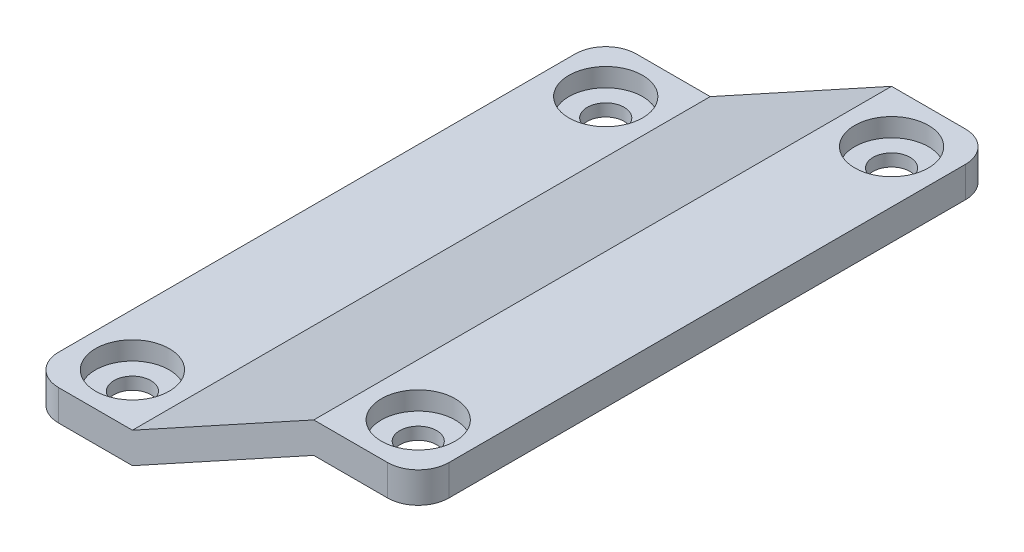
ISO-10303-21;
HEADER;
FILE_DESCRIPTION(('STEP AP214'),'2;1');
FILE_NAME('part.step','',(''),(''),'','','');
FILE_SCHEMA(('AUTOMOTIVE_DESIGN { 1 0 10303 214 1 1 1 1 }'));
ENDSEC;
DATA;
#1=APPLICATION_CONTEXT('core data for automotive mechanical design processes');
#2=APPLICATION_PROTOCOL_DEFINITION('international standard','automotive_design',2000,#1);
#3=PRODUCT_CONTEXT('',#1,'mechanical');
#4=PRODUCT('Part','Part','',(#3));
#5=PRODUCT_RELATED_PRODUCT_CATEGORY('part','',(#4));
#6=PRODUCT_DEFINITION_FORMATION('','',#4);
#7=PRODUCT_DEFINITION_CONTEXT('part definition',#1,'design');
#8=PRODUCT_DEFINITION('design','',#6,#7);
#9=PRODUCT_DEFINITION_SHAPE('','',#8);
#10=(LENGTH_UNIT() NAMED_UNIT(*) SI_UNIT(.MILLI.,.METRE.));
#11=(NAMED_UNIT(*) PLANE_ANGLE_UNIT() SI_UNIT($,.RADIAN.));
#12=(NAMED_UNIT(*) SI_UNIT($,.STERADIAN.) SOLID_ANGLE_UNIT());
#13=UNCERTAINTY_MEASURE_WITH_UNIT(LENGTH_MEASURE(1.E-05),#10,'distance_accuracy_value','');
#14=(GEOMETRIC_REPRESENTATION_CONTEXT(3) GLOBAL_UNCERTAINTY_ASSIGNED_CONTEXT((#13)) GLOBAL_UNIT_ASSIGNED_CONTEXT((#10,
#11,#12)) REPRESENTATION_CONTEXT('',''));
#15=CARTESIAN_POINT('',(0.,0.,0.));
#16=DIRECTION('',(0.,0.,1.));
#17=DIRECTION('',(1.,0.,0.));
#18=AXIS2_PLACEMENT_3D('',#15,#16,#17);
#19=CARTESIAN_POINT('',(-15.0077541769523,-9.56898329219079,-94.));
#20=DIRECTION('',(0.48134834326553,-0.876529390514391,0.));
#21=DIRECTION('',(0.876529390514391,0.48134834326553,0.));
#22=AXIS2_PLACEMENT_3D('',#19,#20,#21);
#23=PLANE('',#22);
#24=DIRECTION('',(0.876529390514391,0.48134834326553,0.));
#25=VECTOR('',#24,1.);
#26=CARTESIAN_POINT('',(-15.0077541769523,-9.56898329219079,0.));
#27=LINE('',#26,#25);
#28=CARTESIAN_POINT('',(-15.0077541769523,-9.56898329219079,0.));
#29=VERTEX_POINT('',#28);
#30=CARTESIAN_POINT('',(14.4922458230477,6.6310167078092,0.));
#31=VERTEX_POINT('',#30);
#32=EDGE_CURVE('E181',#29,#31,#27,.T.);
#33=ORIENTED_EDGE('',*,*,#32,.F.);
#34=DIRECTION('',(0.,0.,1.));
#35=VECTOR('',#34,1.);
#36=CARTESIAN_POINT('',(-15.0077541769523,-9.56898329219079,-94.));
#37=LINE('',#36,#35);
#38=CARTESIAN_POINT('',(-15.0077541769523,-9.56898329219079,-94.));
#39=VERTEX_POINT('',#38);
#40=EDGE_CURVE('E158',#39,#29,#37,.T.);
#41=ORIENTED_EDGE('',*,*,#40,.F.);
#42=DIRECTION('',(0.876529390514391,0.48134834326553,0.));
#43=VECTOR('',#42,1.);
#44=CARTESIAN_POINT('',(-15.0077541769523,-9.56898329219079,-94.));
#45=LINE('',#44,#43);
#46=CARTESIAN_POINT('',(14.4922458230477,6.6310167078092,-94.));
#47=VERTEX_POINT('',#46);
#48=EDGE_CURVE('E149',#39,#47,#45,.T.);
#49=ORIENTED_EDGE('',*,*,#48,.T.);
#50=DIRECTION('',(0.,0.,1.));
#51=VECTOR('',#50,1.);
#52=CARTESIAN_POINT('',(14.4922458230477,6.6310167078092,-94.));
#53=LINE('',#52,#51);
#54=EDGE_CURVE('E131',#47,#31,#53,.T.);
#55=ORIENTED_EDGE('',*,*,#54,.T.);
#56=EDGE_LOOP('',(#33,#41,#49,#55));
#57=FACE_BOUND('',#56,.T.);
#58=ADVANCED_FACE('F41',(#57),#23,.T.);
#59=CARTESIAN_POINT('',(-15.0077541769523,-9.56898329219079,-94.));
#60=DIRECTION('',(0.,-1.,0.));
#61=DIRECTION('',(1.,0.,0.));
#62=AXIS2_PLACEMENT_3D('',#59,#60,#61);
#63=PLANE('',#62);
#64=CARTESIAN_POINT('',(-23.5077541769523,-9.56898329219079,-85.5));
#65=DIRECTION('',(0.,1.,0.));
#66=DIRECTION('',(0.,0.,1.));
#67=AXIS2_PLACEMENT_3D('',#64,#65,#66);
#68=CIRCLE('',#67,3.);
#69=CARTESIAN_POINT('',(-23.5077541769523,-9.56898329219079,-82.5));
#70=VERTEX_POINT('',#69);
#71=EDGE_CURVE('E429',#70,#70,#68,.T.);
#72=ORIENTED_EDGE('',*,*,#71,.T.);
#73=EDGE_LOOP('',(#72));
#74=FACE_BOUND('',#73,.T.);
#75=CARTESIAN_POINT('',(-23.5077541769523,-9.56898329219079,-8.5));
#76=DIRECTION('',(0.,1.,0.));
#77=DIRECTION('',(0.,0.,1.));
#78=AXIS2_PLACEMENT_3D('',#75,#76,#77);
#79=CIRCLE('',#78,3.);
#80=CARTESIAN_POINT('',(-23.5077541769523,-9.56898329219079,-5.5));
#81=VERTEX_POINT('',#80);
#82=EDGE_CURVE('E166',#81,#81,#79,.T.);
#83=ORIENTED_EDGE('',*,*,#82,.T.);
#84=EDGE_LOOP('',(#83));
#85=FACE_BOUND('',#84,.T.);
#86=DIRECTION('',(0.,0.,1.));
#87=VECTOR('',#86,1.);
#88=CARTESIAN_POINT('',(-32.0077541769523,-9.5689832921908,-94.));
#89=LINE('',#88,#87);
#90=CARTESIAN_POINT('',(-32.0077541769523,-9.5689832921908,-89.));
#91=VERTEX_POINT('',#90);
#92=CARTESIAN_POINT('',(-32.0077541769523,-9.5689832921908,-5.));
#93=VERTEX_POINT('',#92);
#94=EDGE_CURVE('E199',#91,#93,#89,.T.);
#95=ORIENTED_EDGE('',*,*,#94,.F.);
#96=CARTESIAN_POINT('',(-27.0077541769523,-9.56898329219079,-89.));
#97=DIRECTION('',(0.,-1.,0.));
#98=DIRECTION('',(1.,0.,0.));
#99=AXIS2_PLACEMENT_3D('',#96,#97,#98);
#100=CIRCLE('',#99,5.);
#101=CARTESIAN_POINT('',(-27.0077541769523,-9.56898329219079,-94.));
#102=VERTEX_POINT('',#101);
#103=EDGE_CURVE('E229',#91,#102,#100,.T.);
#104=ORIENTED_EDGE('',*,*,#103,.T.);
#105=DIRECTION('',(1.,0.,0.));
#106=VECTOR('',#105,1.);
#107=CARTESIAN_POINT('',(-15.0077541769523,-9.56898329219079,-94.));
#108=LINE('',#107,#106);
#109=EDGE_CURVE('E143',#102,#39,#108,.T.);
#110=ORIENTED_EDGE('',*,*,#109,.T.);
#111=ORIENTED_EDGE('',*,*,#40,.T.);
#112=DIRECTION('',(1.,0.,0.));
#113=VECTOR('',#112,1.);
#114=CARTESIAN_POINT('',(-15.0077541769523,-9.56898329219079,0.));
#115=LINE('',#114,#113);
#116=CARTESIAN_POINT('',(-27.0077541769523,-9.56898329219079,0.));
#117=VERTEX_POINT('',#116);
#118=EDGE_CURVE('E160',#117,#29,#115,.T.);
#119=ORIENTED_EDGE('',*,*,#118,.F.);
#120=CARTESIAN_POINT('',(-27.0077541769523,-9.56898329219079,-5.));
#121=DIRECTION('',(0.,-1.,0.));
#122=DIRECTION('',(1.,0.,0.));
#123=AXIS2_PLACEMENT_3D('',#120,#121,#122);
#124=CIRCLE('',#123,5.);
#125=EDGE_CURVE('E226',#117,#93,#124,.T.);
#126=ORIENTED_EDGE('',*,*,#125,.T.);
#127=EDGE_LOOP('',(#95,#104,#110,#111,#119,#126));
#128=FACE_BOUND('',#127,.T.);
#129=ADVANCED_FACE('F270',(#74,#85,#128),#63,.T.);
#130=CARTESIAN_POINT('',(-32.0077541769523,-9.5689832921908,-94.));
#131=DIRECTION('',(-1.,0.,0.));
#132=DIRECTION('',(0.,0.,1.));
#133=AXIS2_PLACEMENT_3D('',#130,#131,#132);
#134=PLANE('',#133);
#135=DIRECTION('',(0.,0.,1.));
#136=VECTOR('',#135,1.);
#137=CARTESIAN_POINT('',(-32.0077541769523,-4.5689832921908,-94.));
#138=LINE('',#137,#136);
#139=CARTESIAN_POINT('',(-32.0077541769523,-4.5689832921908,-89.));
#140=VERTEX_POINT('',#139);
#141=CARTESIAN_POINT('',(-32.0077541769523,-4.5689832921908,-5.));
#142=VERTEX_POINT('',#141);
#143=EDGE_CURVE('E203',#140,#142,#138,.T.);
#144=ORIENTED_EDGE('',*,*,#143,.F.);
#145=DIRECTION('',(0.,-1.,0.));
#146=VECTOR('',#145,1.);
#147=CARTESIAN_POINT('',(-32.0077541769523,-9.5689832921908,-89.));
#148=LINE('',#147,#146);
#149=EDGE_CURVE('E222',#140,#91,#148,.T.);
#150=ORIENTED_EDGE('',*,*,#149,.T.);
#151=ORIENTED_EDGE('',*,*,#94,.T.);
#152=DIRECTION('',(0.,-1.,0.));
#153=VECTOR('',#152,1.);
#154=CARTESIAN_POINT('',(-32.0077541769523,-9.5689832921908,-5.));
#155=LINE('',#154,#153);
#156=EDGE_CURVE('E198',#93,#142,#155,.F.);
#157=ORIENTED_EDGE('',*,*,#156,.T.);
#158=EDGE_LOOP('',(#144,#150,#151,#157));
#159=FACE_BOUND('',#158,.T.);
#160=ADVANCED_FACE('F293',(#159),#134,.T.);
#161=CARTESIAN_POINT('',(-15.0077541769523,-4.5689832921908,-94.));
#162=DIRECTION('',(0.,1.,0.));
#163=DIRECTION('',(-1.,0.,0.));
#164=AXIS2_PLACEMENT_3D('',#161,#162,#163);
#165=PLANE('',#164);
#166=CARTESIAN_POINT('',(-23.5077541769523,-4.56898329219079,-85.5));
#167=DIRECTION('',(0.,1.,0.));
#168=DIRECTION('',(0.,0.,1.));
#169=AXIS2_PLACEMENT_3D('',#166,#167,#168);
#170=CIRCLE('',#169,6.);
#171=CARTESIAN_POINT('',(-23.5077541769523,-4.56898329219079,-79.5));
#172=VERTEX_POINT('',#171);
#173=EDGE_CURVE('E417',#172,#172,#170,.T.);
#174=ORIENTED_EDGE('',*,*,#173,.F.);
#175=EDGE_LOOP('',(#174));
#176=FACE_BOUND('',#175,.T.);
#177=CARTESIAN_POINT('',(-23.5077541769523,-4.56898329219079,-8.5));
#178=DIRECTION('',(0.,1.,0.));
#179=DIRECTION('',(0.,0.,1.));
#180=AXIS2_PLACEMENT_3D('',#177,#178,#179);
#181=CIRCLE('',#180,6.);
#182=CARTESIAN_POINT('',(-23.5077541769523,-4.56898329219079,-2.5));
#183=VERTEX_POINT('',#182);
#184=EDGE_CURVE('E433',#183,#183,#181,.T.);
#185=ORIENTED_EDGE('',*,*,#184,.F.);
#186=EDGE_LOOP('',(#185));
#187=FACE_BOUND('',#186,.T.);
#188=DIRECTION('',(-1.,0.,0.));
#189=VECTOR('',#188,1.);
#190=CARTESIAN_POINT('',(-15.0077541769523,-4.5689832921908,-94.));
#191=LINE('',#190,#189);
#192=CARTESIAN_POINT('',(-15.0077541769523,-4.5689832921908,-94.));
#193=VERTEX_POINT('',#192);
#194=CARTESIAN_POINT('',(-27.0077541769523,-4.5689832921908,-94.));
#195=VERTEX_POINT('',#194);
#196=EDGE_CURVE('E175',#193,#195,#191,.T.);
#197=ORIENTED_EDGE('',*,*,#196,.T.);
#198=CARTESIAN_POINT('',(-27.0077541769523,-4.5689832921908,-89.));
#199=DIRECTION('',(0.,1.,0.));
#200=DIRECTION('',(-1.,0.,0.));
#201=AXIS2_PLACEMENT_3D('',#198,#199,#200);
#202=CIRCLE('',#201,5.);
#203=EDGE_CURVE('E240',#195,#140,#202,.T.);
#204=ORIENTED_EDGE('',*,*,#203,.T.);
#205=ORIENTED_EDGE('',*,*,#143,.T.);
#206=CARTESIAN_POINT('',(-27.0077541769523,-4.5689832921908,-5.));
#207=DIRECTION('',(0.,1.,0.));
#208=DIRECTION('',(-1.,0.,0.));
#209=AXIS2_PLACEMENT_3D('',#206,#207,#208);
#210=CIRCLE('',#209,5.);
#211=CARTESIAN_POINT('',(-27.0077541769523,-4.5689832921908,0.));
#212=VERTEX_POINT('',#211);
#213=EDGE_CURVE('E237',#142,#212,#210,.T.);
#214=ORIENTED_EDGE('',*,*,#213,.T.);
#215=DIRECTION('',(-1.,0.,0.));
#216=VECTOR('',#215,1.);
#217=CARTESIAN_POINT('',(-15.0077541769523,-4.5689832921908,0.));
#218=LINE('',#217,#216);
#219=CARTESIAN_POINT('',(-15.0077541769523,-4.5689832921908,0.));
#220=VERTEX_POINT('',#219);
#221=EDGE_CURVE('E163',#220,#212,#218,.T.);
#222=ORIENTED_EDGE('',*,*,#221,.F.);
#223=DIRECTION('',(0.,0.,1.));
#224=VECTOR('',#223,1.);
#225=CARTESIAN_POINT('',(-15.0077541769523,-4.5689832921908,-94.));
#226=LINE('',#225,#224);
#227=EDGE_CURVE('E207',#193,#220,#226,.T.);
#228=ORIENTED_EDGE('',*,*,#227,.F.);
#229=EDGE_LOOP('',(#197,#204,#205,#214,#222,#228));
#230=FACE_BOUND('',#229,.T.);
#231=ADVANCED_FACE('F289',(#176,#187,#230),#165,.T.);
#232=CARTESIAN_POINT('',(-15.0077541769523,-4.5689832921908,-94.));
#233=DIRECTION('',(-0.48134834326553,0.876529390514391,0.));
#234=DIRECTION('',(-0.876529390514391,-0.48134834326553,0.));
#235=AXIS2_PLACEMENT_3D('',#232,#233,#234);
#236=PLANE('',#235);
#237=DIRECTION('',(-0.876529390514391,-0.48134834326553,0.));
#238=VECTOR('',#237,1.);
#239=CARTESIAN_POINT('',(-15.0077541769523,-4.5689832921908,0.));
#240=LINE('',#239,#238);
#241=CARTESIAN_POINT('',(14.4922458230477,11.6310167078092,0.));
#242=VERTEX_POINT('',#241);
#243=EDGE_CURVE('E189',#242,#220,#240,.T.);
#244=ORIENTED_EDGE('',*,*,#243,.F.);
#245=DIRECTION('',(0.,0.,1.));
#246=VECTOR('',#245,1.);
#247=CARTESIAN_POINT('',(14.4922458230477,11.6310167078092,-94.));
#248=LINE('',#247,#246);
#249=CARTESIAN_POINT('',(14.4922458230477,11.6310167078092,-94.));
#250=VERTEX_POINT('',#249);
#251=EDGE_CURVE('E210',#250,#242,#248,.T.);
#252=ORIENTED_EDGE('',*,*,#251,.F.);
#253=DIRECTION('',(-0.876529390514391,-0.48134834326553,0.));
#254=VECTOR('',#253,1.);
#255=CARTESIAN_POINT('',(-15.0077541769523,-4.5689832921908,-94.));
#256=LINE('',#255,#254);
#257=EDGE_CURVE('E171',#250,#193,#256,.T.);
#258=ORIENTED_EDGE('',*,*,#257,.T.);
#259=ORIENTED_EDGE('',*,*,#227,.T.);
#260=EDGE_LOOP('',(#244,#252,#258,#259));
#261=FACE_BOUND('',#260,.T.);
#262=ADVANCED_FACE('F285',(#261),#236,.T.);
#263=CARTESIAN_POINT('',(14.4922458230477,11.6310167078092,-94.));
#264=DIRECTION('',(0.,1.,0.));
#265=DIRECTION('',(0.,0.,1.));
#266=AXIS2_PLACEMENT_3D('',#263,#264,#265);
#267=PLANE('',#266);
#268=CARTESIAN_POINT('',(22.9922458230477,11.6310167078092,-8.49999999999999));
#269=DIRECTION('',(0.,1.,0.));
#270=DIRECTION('',(0.,0.,1.));
#271=AXIS2_PLACEMENT_3D('',#268,#269,#270);
#272=CIRCLE('',#271,6.);
#273=CARTESIAN_POINT('',(22.9922458230477,11.6310167078092,-2.5));
#274=VERTEX_POINT('',#273);
#275=EDGE_CURVE('E389',#274,#274,#272,.T.);
#276=ORIENTED_EDGE('',*,*,#275,.F.);
#277=EDGE_LOOP('',(#276));
#278=FACE_BOUND('',#277,.T.);
#279=CARTESIAN_POINT('',(22.9922458230477,11.6310167078092,-85.5));
#280=DIRECTION('',(0.,1.,0.));
#281=DIRECTION('',(0.,0.,1.));
#282=AXIS2_PLACEMENT_3D('',#279,#280,#281);
#283=CIRCLE('',#282,6.);
#284=CARTESIAN_POINT('',(22.9922458230477,11.6310167078092,-79.5));
#285=VERTEX_POINT('',#284);
#286=EDGE_CURVE('E401',#285,#285,#283,.T.);
#287=ORIENTED_EDGE('',*,*,#286,.F.);
#288=EDGE_LOOP('',(#287));
#289=FACE_BOUND('',#288,.T.);
#290=DIRECTION('',(0.,0.,1.));
#291=VECTOR('',#290,1.);
#292=CARTESIAN_POINT('',(31.4922458230477,11.6310167078092,-94.));
#293=LINE('',#292,#291);
#294=CARTESIAN_POINT('',(31.4922458230477,11.6310167078092,-89.));
#295=VERTEX_POINT('',#294);
#296=CARTESIAN_POINT('',(31.4922458230477,11.6310167078092,-5.));
#297=VERTEX_POINT('',#296);
#298=EDGE_CURVE('E214',#295,#297,#293,.T.);
#299=ORIENTED_EDGE('',*,*,#298,.F.);
#300=CARTESIAN_POINT('',(26.4922458230477,11.6310167078092,-89.));
#301=DIRECTION('',(0.,1.,0.));
#302=DIRECTION('',(0.,0.,1.));
#303=AXIS2_PLACEMENT_3D('',#300,#301,#302);
#304=CIRCLE('',#303,5.);
#305=CARTESIAN_POINT('',(26.4922458230477,11.6310167078092,-94.));
#306=VERTEX_POINT('',#305);
#307=EDGE_CURVE('E252',#295,#306,#304,.T.);
#308=ORIENTED_EDGE('',*,*,#307,.T.);
#309=DIRECTION('',(-1.,0.,0.));
#310=VECTOR('',#309,1.);
#311=CARTESIAN_POINT('',(14.4922458230477,11.6310167078092,-94.));
#312=LINE('',#311,#310);
#313=EDGE_CURVE('E154',#306,#250,#312,.T.);
#314=ORIENTED_EDGE('',*,*,#313,.T.);
#315=ORIENTED_EDGE('',*,*,#251,.T.);
#316=DIRECTION('',(-1.,0.,0.));
#317=VECTOR('',#316,1.);
#318=CARTESIAN_POINT('',(14.4922458230477,11.6310167078092,0.));
#319=LINE('',#318,#317);
#320=CARTESIAN_POINT('',(26.4922458230477,11.6310167078092,0.));
#321=VERTEX_POINT('',#320);
#322=EDGE_CURVE('E186',#321,#242,#319,.T.);
#323=ORIENTED_EDGE('',*,*,#322,.F.);
#324=CARTESIAN_POINT('',(26.4922458230477,11.6310167078092,-5.));
#325=DIRECTION('',(0.,1.,0.));
#326=DIRECTION('',(0.,0.,1.));
#327=AXIS2_PLACEMENT_3D('',#324,#325,#326);
#328=CIRCLE('',#327,5.);
#329=EDGE_CURVE('E65',#321,#297,#328,.T.);
#330=ORIENTED_EDGE('',*,*,#329,.T.);
#331=EDGE_LOOP('',(#299,#308,#314,#315,#323,#330));
#332=FACE_BOUND('',#331,.T.);
#333=ADVANCED_FACE('F281',(#278,#289,#332),#267,.T.);
#334=CARTESIAN_POINT('',(31.4922458230477,6.6310167078092,-94.));
#335=DIRECTION('',(1.,0.,0.));
#336=DIRECTION('',(0.,0.,-1.));
#337=AXIS2_PLACEMENT_3D('',#334,#335,#336);
#338=PLANE('',#337);
#339=DIRECTION('',(0.,0.,1.));
#340=VECTOR('',#339,1.);
#341=CARTESIAN_POINT('',(31.4922458230477,6.6310167078092,-94.));
#342=LINE('',#341,#340);
#343=CARTESIAN_POINT('',(31.4922458230477,6.6310167078092,-89.));
#344=VERTEX_POINT('',#343);
#345=CARTESIAN_POINT('',(31.4922458230477,6.6310167078092,-5.));
#346=VERTEX_POINT('',#345);
#347=EDGE_CURVE('E142',#344,#346,#342,.T.);
#348=ORIENTED_EDGE('',*,*,#347,.F.);
#349=DIRECTION('',(0.,1.,0.));
#350=VECTOR('',#349,1.);
#351=CARTESIAN_POINT('',(31.4922458230477,11.6310167078092,-89.));
#352=LINE('',#351,#350);
#353=EDGE_CURVE('E246',#344,#295,#352,.T.);
#354=ORIENTED_EDGE('',*,*,#353,.T.);
#355=ORIENTED_EDGE('',*,*,#298,.T.);
#356=DIRECTION('',(0.,1.,0.));
#357=VECTOR('',#356,1.);
#358=CARTESIAN_POINT('',(31.4922458230477,6.6310167078092,-5.));
#359=LINE('',#358,#357);
#360=EDGE_CURVE('E243',#297,#346,#359,.F.);
#361=ORIENTED_EDGE('',*,*,#360,.T.);
#362=EDGE_LOOP('',(#348,#354,#355,#361));
#363=FACE_BOUND('',#362,.T.);
#364=ADVANCED_FACE('F275',(#363),#338,.T.);
#365=CARTESIAN_POINT('',(14.4922458230477,6.6310167078092,-94.));
#366=DIRECTION('',(0.,-1.,0.));
#367=DIRECTION('',(0.,0.,-1.));
#368=AXIS2_PLACEMENT_3D('',#365,#366,#367);
#369=PLANE('',#368);
#370=CARTESIAN_POINT('',(22.9922458230477,6.6310167078092,-8.49999999999999));
#371=DIRECTION('',(0.,-1.,0.));
#372=DIRECTION('',(0.,0.,-1.));
#373=AXIS2_PLACEMENT_3D('',#370,#371,#372);
#374=CIRCLE('',#373,3.);
#375=CARTESIAN_POINT('',(22.9922458230477,6.6310167078092,-11.5));
#376=VERTEX_POINT('',#375);
#377=EDGE_CURVE('E393',#376,#376,#374,.T.);
#378=ORIENTED_EDGE('',*,*,#377,.F.);
#379=EDGE_LOOP('',(#378));
#380=FACE_BOUND('',#379,.T.);
#381=CARTESIAN_POINT('',(22.9922458230477,6.6310167078092,-85.5));
#382=DIRECTION('',(0.,-1.,0.));
#383=DIRECTION('',(0.,0.,-1.));
#384=AXIS2_PLACEMENT_3D('',#381,#382,#383);
#385=CIRCLE('',#384,3.);
#386=CARTESIAN_POINT('',(22.9922458230477,6.6310167078092,-88.5));
#387=VERTEX_POINT('',#386);
#388=EDGE_CURVE('E413',#387,#387,#385,.T.);
#389=ORIENTED_EDGE('',*,*,#388,.F.);
#390=EDGE_LOOP('',(#389));
#391=FACE_BOUND('',#390,.T.);
#392=DIRECTION('',(1.,0.,0.));
#393=VECTOR('',#392,1.);
#394=CARTESIAN_POINT('',(14.4922458230477,6.6310167078092,-94.));
#395=LINE('',#394,#393);
#396=CARTESIAN_POINT('',(26.4922458230477,6.6310167078092,-94.));
#397=VERTEX_POINT('',#396);
#398=EDGE_CURVE('E134',#47,#397,#395,.T.);
#399=ORIENTED_EDGE('',*,*,#398,.T.);
#400=CARTESIAN_POINT('',(26.4922458230477,6.6310167078092,-89.));
#401=DIRECTION('',(0.,-1.,0.));
#402=DIRECTION('',(0.,0.,-1.));
#403=AXIS2_PLACEMENT_3D('',#400,#401,#402);
#404=CIRCLE('',#403,5.);
#405=EDGE_CURVE('E257',#397,#344,#404,.T.);
#406=ORIENTED_EDGE('',*,*,#405,.T.);
#407=ORIENTED_EDGE('',*,*,#347,.T.);
#408=CARTESIAN_POINT('',(26.4922458230477,6.6310167078092,-5.));
#409=DIRECTION('',(0.,-1.,0.));
#410=DIRECTION('',(0.,0.,-1.));
#411=AXIS2_PLACEMENT_3D('',#408,#409,#410);
#412=CIRCLE('',#411,5.);
#413=CARTESIAN_POINT('',(26.4922458230477,6.6310167078092,0.));
#414=VERTEX_POINT('',#413);
#415=EDGE_CURVE('E57',#346,#414,#412,.T.);
#416=ORIENTED_EDGE('',*,*,#415,.T.);
#417=DIRECTION('',(1.,0.,0.));
#418=VECTOR('',#417,1.);
#419=CARTESIAN_POINT('',(14.4922458230477,6.6310167078092,0.));
#420=LINE('',#419,#418);
#421=EDGE_CURVE('E136',#31,#414,#420,.T.);
#422=ORIENTED_EDGE('',*,*,#421,.F.);
#423=ORIENTED_EDGE('',*,*,#54,.F.);
#424=EDGE_LOOP('',(#399,#406,#407,#416,#422,#423));
#425=FACE_BOUND('',#424,.T.);
#426=ADVANCED_FACE('F133',(#380,#391,#425),#369,.T.);
#427=CARTESIAN_POINT('',(0.,0.,-94.));
#428=DIRECTION('',(0.,0.,1.));
#429=DIRECTION('',(1.,0.,0.));
#430=AXIS2_PLACEMENT_3D('',#427,#428,#429);
#431=PLANE('',#430);
#432=ORIENTED_EDGE('',*,*,#109,.F.);
#433=DIRECTION('',(0.,-1.,0.));
#434=VECTOR('',#433,1.);
#435=CARTESIAN_POINT('',(-27.0077541769523,-4.5689832921908,-94.));
#436=LINE('',#435,#434);
#437=EDGE_CURVE('E234',#102,#195,#436,.F.);
#438=ORIENTED_EDGE('',*,*,#437,.T.);
#439=ORIENTED_EDGE('',*,*,#196,.F.);
#440=ORIENTED_EDGE('',*,*,#257,.F.);
#441=ORIENTED_EDGE('',*,*,#313,.F.);
#442=DIRECTION('',(0.,1.,0.));
#443=VECTOR('',#442,1.);
#444=CARTESIAN_POINT('',(26.4922458230477,6.6310167078092,-94.));
#445=LINE('',#444,#443);
#446=EDGE_CURVE('E152',#306,#397,#445,.F.);
#447=ORIENTED_EDGE('',*,*,#446,.T.);
#448=ORIENTED_EDGE('',*,*,#398,.F.);
#449=ORIENTED_EDGE('',*,*,#48,.F.);
#450=EDGE_LOOP('',(#432,#438,#439,#440,#441,#447,#448,#449));
#451=FACE_BOUND('',#450,.T.);
#452=ADVANCED_FACE('F148',(#451),#431,.F.);
#453=CARTESIAN_POINT('',(0.,0.,0.));
#454=DIRECTION('',(0.,0.,1.));
#455=DIRECTION('',(1.,0.,0.));
#456=AXIS2_PLACEMENT_3D('',#453,#454,#455);
#457=PLANE('',#456);
#458=ORIENTED_EDGE('',*,*,#421,.T.);
#459=DIRECTION('',(0.,1.,0.));
#460=VECTOR('',#459,1.);
#461=CARTESIAN_POINT('',(26.4922458230477,0.,0.));
#462=LINE('',#461,#460);
#463=EDGE_CURVE('E11',#414,#321,#462,.T.);
#464=ORIENTED_EDGE('',*,*,#463,.T.);
#465=ORIENTED_EDGE('',*,*,#322,.T.);
#466=ORIENTED_EDGE('',*,*,#243,.T.);
#467=ORIENTED_EDGE('',*,*,#221,.T.);
#468=DIRECTION('',(0.,-1.,0.));
#469=VECTOR('',#468,1.);
#470=CARTESIAN_POINT('',(-27.0077541769523,0.,0.));
#471=LINE('',#470,#469);
#472=EDGE_CURVE('E50',#212,#117,#471,.T.);
#473=ORIENTED_EDGE('',*,*,#472,.T.);
#474=ORIENTED_EDGE('',*,*,#118,.T.);
#475=ORIENTED_EDGE('',*,*,#32,.T.);
#476=EDGE_LOOP('',(#458,#464,#465,#466,#467,#473,#474,#475));
#477=FACE_BOUND('',#476,.T.);
#478=ADVANCED_FACE('F264',(#477),#457,.T.);
#479=CARTESIAN_POINT('',(-23.5077541769523,-4.56898329219079,-8.5));
#480=DIRECTION('',(0.,1.,0.));
#481=DIRECTION('',(0.,0.,1.));
#482=AXIS2_PLACEMENT_3D('',#479,#480,#481);
#483=CYLINDRICAL_SURFACE('',#482,3.);
#484=ORIENTED_EDGE('',*,*,#82,.F.);
#485=EDGE_LOOP('',(#484));
#486=FACE_BOUND('',#485,.T.);
#487=CARTESIAN_POINT('',(-23.5077541769523,-7.56898329219079,-8.5));
#488=DIRECTION('',(0.,1.,0.));
#489=DIRECTION('',(0.,0.,1.));
#490=AXIS2_PLACEMENT_3D('',#487,#488,#489);
#491=CIRCLE('',#490,3.);
#492=CARTESIAN_POINT('',(-23.5077541769523,-7.56898329219079,-5.5));
#493=VERTEX_POINT('',#492);
#494=EDGE_CURVE('E440',#493,#493,#491,.T.);
#495=ORIENTED_EDGE('',*,*,#494,.T.);
#496=EDGE_LOOP('',(#495));
#497=FACE_BOUND('',#496,.T.);
#498=ADVANCED_FACE('F335',(#486,#497),#483,.F.);
#499=CARTESIAN_POINT('',(-20.5077541769523,-7.56898329219079,-8.5));
#500=DIRECTION('',(0.,-1.,0.));
#501=DIRECTION('',(0.,0.,-1.));
#502=AXIS2_PLACEMENT_3D('',#499,#500,#501);
#503=PLANE('',#502);
#504=ORIENTED_EDGE('',*,*,#494,.F.);
#505=EDGE_LOOP('',(#504));
#506=FACE_BOUND('',#505,.T.);
#507=CARTESIAN_POINT('',(-23.5077541769523,-7.56898329219079,-8.5));
#508=DIRECTION('',(0.,1.,0.));
#509=DIRECTION('',(0.,0.,1.));
#510=AXIS2_PLACEMENT_3D('',#507,#508,#509);
#511=CIRCLE('',#510,6.);
#512=CARTESIAN_POINT('',(-23.5077541769523,-7.56898329219079,-2.5));
#513=VERTEX_POINT('',#512);
#514=EDGE_CURVE('E437',#513,#513,#511,.T.);
#515=ORIENTED_EDGE('',*,*,#514,.T.);
#516=EDGE_LOOP('',(#515));
#517=FACE_BOUND('',#516,.T.);
#518=ADVANCED_FACE('F340',(#506,#517),#503,.F.);
#519=CARTESIAN_POINT('',(-23.5077541769523,-4.56898329219079,-8.5));
#520=DIRECTION('',(0.,1.,0.));
#521=DIRECTION('',(0.,0.,1.));
#522=AXIS2_PLACEMENT_3D('',#519,#520,#521);
#523=CYLINDRICAL_SURFACE('',#522,6.);
#524=ORIENTED_EDGE('',*,*,#514,.F.);
#525=EDGE_LOOP('',(#524));
#526=FACE_BOUND('',#525,.T.);
#527=ORIENTED_EDGE('',*,*,#184,.T.);
#528=EDGE_LOOP('',(#527));
#529=FACE_BOUND('',#528,.T.);
#530=ADVANCED_FACE('F344',(#526,#529),#523,.F.);
#531=CARTESIAN_POINT('',(-23.5077541769523,-4.56898329219079,-85.5));
#532=DIRECTION('',(0.,1.,0.));
#533=DIRECTION('',(0.,0.,1.));
#534=AXIS2_PLACEMENT_3D('',#531,#532,#533);
#535=CYLINDRICAL_SURFACE('',#534,3.);
#536=ORIENTED_EDGE('',*,*,#71,.F.);
#537=EDGE_LOOP('',(#536));
#538=FACE_BOUND('',#537,.T.);
#539=CARTESIAN_POINT('',(-23.5077541769523,-7.56898329219079,-85.5));
#540=DIRECTION('',(0.,1.,0.));
#541=DIRECTION('',(0.,0.,1.));
#542=AXIS2_PLACEMENT_3D('',#539,#540,#541);
#543=CIRCLE('',#542,3.);
#544=CARTESIAN_POINT('',(-23.5077541769523,-7.56898329219079,-82.5));
#545=VERTEX_POINT('',#544);
#546=EDGE_CURVE('E425',#545,#545,#543,.T.);
#547=ORIENTED_EDGE('',*,*,#546,.T.);
#548=EDGE_LOOP('',(#547));
#549=FACE_BOUND('',#548,.T.);
#550=ADVANCED_FACE('F348',(#538,#549),#535,.F.);
#551=CARTESIAN_POINT('',(-20.5077541769523,-7.56898329219079,-85.5));
#552=DIRECTION('',(0.,-1.,0.));
#553=DIRECTION('',(0.,0.,-1.));
#554=AXIS2_PLACEMENT_3D('',#551,#552,#553);
#555=PLANE('',#554);
#556=ORIENTED_EDGE('',*,*,#546,.F.);
#557=EDGE_LOOP('',(#556));
#558=FACE_BOUND('',#557,.T.);
#559=CARTESIAN_POINT('',(-23.5077541769523,-7.56898329219079,-85.5));
#560=DIRECTION('',(0.,1.,0.));
#561=DIRECTION('',(0.,0.,1.));
#562=AXIS2_PLACEMENT_3D('',#559,#560,#561);
#563=CIRCLE('',#562,6.);
#564=CARTESIAN_POINT('',(-23.5077541769523,-7.56898329219079,-79.5));
#565=VERTEX_POINT('',#564);
#566=EDGE_CURVE('E421',#565,#565,#563,.T.);
#567=ORIENTED_EDGE('',*,*,#566,.T.);
#568=EDGE_LOOP('',(#567));
#569=FACE_BOUND('',#568,.T.);
#570=ADVANCED_FACE('F352',(#558,#569),#555,.F.);
#571=CARTESIAN_POINT('',(-23.5077541769523,-4.56898329219079,-85.5));
#572=DIRECTION('',(0.,1.,0.));
#573=DIRECTION('',(0.,0.,1.));
#574=AXIS2_PLACEMENT_3D('',#571,#572,#573);
#575=CYLINDRICAL_SURFACE('',#574,6.);
#576=ORIENTED_EDGE('',*,*,#566,.F.);
#577=EDGE_LOOP('',(#576));
#578=FACE_BOUND('',#577,.T.);
#579=ORIENTED_EDGE('',*,*,#173,.T.);
#580=EDGE_LOOP('',(#579));
#581=FACE_BOUND('',#580,.T.);
#582=ADVANCED_FACE('F356',(#578,#581),#575,.F.);
#583=CARTESIAN_POINT('',(22.9922458230477,11.6310167078092,-85.5));
#584=DIRECTION('',(0.,1.,0.));
#585=DIRECTION('',(0.,0.,1.));
#586=AXIS2_PLACEMENT_3D('',#583,#584,#585);
#587=CYLINDRICAL_SURFACE('',#586,3.);
#588=CARTESIAN_POINT('',(22.9922458230477,8.63101670780921,-85.5));
#589=DIRECTION('',(0.,1.,0.));
#590=DIRECTION('',(0.,0.,1.));
#591=AXIS2_PLACEMENT_3D('',#588,#589,#590);
#592=CIRCLE('',#591,3.);
#593=CARTESIAN_POINT('',(22.9922458230477,8.63101670780921,-82.5));
#594=VERTEX_POINT('',#593);
#595=EDGE_CURVE('E409',#594,#594,#592,.T.);
#596=ORIENTED_EDGE('',*,*,#595,.T.);
#597=EDGE_LOOP('',(#596));
#598=FACE_BOUND('',#597,.T.);
#599=ORIENTED_EDGE('',*,*,#388,.T.);
#600=EDGE_LOOP('',(#599));
#601=FACE_BOUND('',#600,.T.);
#602=ADVANCED_FACE('F360',(#598,#601),#587,.F.);
#603=CARTESIAN_POINT('',(25.9922458230477,8.63101670780921,-85.5));
#604=DIRECTION('',(0.,-1.,0.));
#605=DIRECTION('',(0.,0.,-1.));
#606=AXIS2_PLACEMENT_3D('',#603,#604,#605);
#607=PLANE('',#606);
#608=ORIENTED_EDGE('',*,*,#595,.F.);
#609=EDGE_LOOP('',(#608));
#610=FACE_BOUND('',#609,.T.);
#611=CARTESIAN_POINT('',(22.9922458230477,8.63101670780921,-85.5));
#612=DIRECTION('',(0.,1.,0.));
#613=DIRECTION('',(0.,0.,1.));
#614=AXIS2_PLACEMENT_3D('',#611,#612,#613);
#615=CIRCLE('',#614,6.);
#616=CARTESIAN_POINT('',(22.9922458230477,8.63101670780921,-79.5));
#617=VERTEX_POINT('',#616);
#618=EDGE_CURVE('E405',#617,#617,#615,.T.);
#619=ORIENTED_EDGE('',*,*,#618,.T.);
#620=EDGE_LOOP('',(#619));
#621=FACE_BOUND('',#620,.T.);
#622=ADVANCED_FACE('F364',(#610,#621),#607,.F.);
#623=CARTESIAN_POINT('',(22.9922458230477,11.6310167078092,-85.5));
#624=DIRECTION('',(0.,1.,0.));
#625=DIRECTION('',(0.,0.,1.));
#626=AXIS2_PLACEMENT_3D('',#623,#624,#625);
#627=CYLINDRICAL_SURFACE('',#626,6.);
#628=ORIENTED_EDGE('',*,*,#618,.F.);
#629=EDGE_LOOP('',(#628));
#630=FACE_BOUND('',#629,.T.);
#631=ORIENTED_EDGE('',*,*,#286,.T.);
#632=EDGE_LOOP('',(#631));
#633=FACE_BOUND('',#632,.T.);
#634=ADVANCED_FACE('F368',(#630,#633),#627,.F.);
#635=CARTESIAN_POINT('',(22.9922458230477,11.6310167078092,-8.49999999999999));
#636=DIRECTION('',(0.,1.,0.));
#637=DIRECTION('',(0.,0.,1.));
#638=AXIS2_PLACEMENT_3D('',#635,#636,#637);
#639=CYLINDRICAL_SURFACE('',#638,3.);
#640=CARTESIAN_POINT('',(22.9922458230477,8.63101670780921,-8.49999999999999));
#641=DIRECTION('',(0.,1.,0.));
#642=DIRECTION('',(0.,0.,1.));
#643=AXIS2_PLACEMENT_3D('',#640,#641,#642);
#644=CIRCLE('',#643,3.);
#645=CARTESIAN_POINT('',(22.9922458230477,8.63101670780921,-5.49999999999999));
#646=VERTEX_POINT('',#645);
#647=EDGE_CURVE('E384',#646,#646,#644,.T.);
#648=ORIENTED_EDGE('',*,*,#647,.T.);
#649=EDGE_LOOP('',(#648));
#650=FACE_BOUND('',#649,.T.);
#651=ORIENTED_EDGE('',*,*,#377,.T.);
#652=EDGE_LOOP('',(#651));
#653=FACE_BOUND('',#652,.T.);
#654=ADVANCED_FACE('F372',(#650,#653),#639,.F.);
#655=CARTESIAN_POINT('',(25.9922458230477,8.63101670780921,-8.49999999999999));
#656=DIRECTION('',(0.,-1.,0.));
#657=DIRECTION('',(0.,0.,-1.));
#658=AXIS2_PLACEMENT_3D('',#655,#656,#657);
#659=PLANE('',#658);
#660=ORIENTED_EDGE('',*,*,#647,.F.);
#661=EDGE_LOOP('',(#660));
#662=FACE_BOUND('',#661,.T.);
#663=CARTESIAN_POINT('',(22.9922458230477,8.63101670780921,-8.49999999999999));
#664=DIRECTION('',(0.,1.,0.));
#665=DIRECTION('',(0.,0.,1.));
#666=AXIS2_PLACEMENT_3D('',#663,#664,#665);
#667=CIRCLE('',#666,6.);
#668=CARTESIAN_POINT('',(22.9922458230477,8.63101670780921,-2.5));
#669=VERTEX_POINT('',#668);
#670=EDGE_CURVE('E387',#669,#669,#667,.T.);
#671=ORIENTED_EDGE('',*,*,#670,.T.);
#672=EDGE_LOOP('',(#671));
#673=FACE_BOUND('',#672,.T.);
#674=ADVANCED_FACE('F307',(#662,#673),#659,.F.);
#675=CARTESIAN_POINT('',(22.9922458230477,11.6310167078092,-8.49999999999999));
#676=DIRECTION('',(0.,1.,0.));
#677=DIRECTION('',(0.,0.,1.));
#678=AXIS2_PLACEMENT_3D('',#675,#676,#677);
#679=CYLINDRICAL_SURFACE('',#678,6.);
#680=ORIENTED_EDGE('',*,*,#670,.F.);
#681=EDGE_LOOP('',(#680));
#682=FACE_BOUND('',#681,.T.);
#683=ORIENTED_EDGE('',*,*,#275,.T.);
#684=EDGE_LOOP('',(#683));
#685=FACE_BOUND('',#684,.T.);
#686=ADVANCED_FACE('F300',(#682,#685),#679,.F.);
#687=CARTESIAN_POINT('',(-27.0077541769523,-9.5689832921908,-89.));
#688=DIRECTION('',(0.,1.,0.));
#689=DIRECTION('',(0.,0.,1.));
#690=AXIS2_PLACEMENT_3D('',#687,#688,#689);
#691=CYLINDRICAL_SURFACE('',#690,5.);
#692=ORIENTED_EDGE('',*,*,#203,.F.);
#693=ORIENTED_EDGE('',*,*,#437,.F.);
#694=ORIENTED_EDGE('',*,*,#103,.F.);
#695=ORIENTED_EDGE('',*,*,#149,.F.);
#696=EDGE_LOOP('',(#692,#693,#694,#695));
#697=FACE_BOUND('',#696,.T.);
#698=ADVANCED_FACE('F298',(#697),#691,.T.);
#699=CARTESIAN_POINT('',(26.4922458230477,6.6310167078092,-89.));
#700=DIRECTION('',(0.,-1.,0.));
#701=DIRECTION('',(0.,0.,-1.));
#702=AXIS2_PLACEMENT_3D('',#699,#700,#701);
#703=CYLINDRICAL_SURFACE('',#702,5.);
#704=ORIENTED_EDGE('',*,*,#405,.F.);
#705=ORIENTED_EDGE('',*,*,#446,.F.);
#706=ORIENTED_EDGE('',*,*,#307,.F.);
#707=ORIENTED_EDGE('',*,*,#353,.F.);
#708=EDGE_LOOP('',(#704,#705,#706,#707));
#709=FACE_BOUND('',#708,.T.);
#710=ADVANCED_FACE('F279',(#709),#703,.T.);
#711=CARTESIAN_POINT('',(26.4922458230477,0.,-5.));
#712=DIRECTION('',(0.,1.,0.));
#713=DIRECTION('',(0.,0.,1.));
#714=AXIS2_PLACEMENT_3D('',#711,#712,#713);
#715=CYLINDRICAL_SURFACE('',#714,5.);
#716=ORIENTED_EDGE('',*,*,#415,.F.);
#717=ORIENTED_EDGE('',*,*,#360,.F.);
#718=ORIENTED_EDGE('',*,*,#329,.F.);
#719=ORIENTED_EDGE('',*,*,#463,.F.);
#720=EDGE_LOOP('',(#716,#717,#718,#719));
#721=FACE_BOUND('',#720,.T.);
#722=ADVANCED_FACE('F272',(#721),#715,.T.);
#723=CARTESIAN_POINT('',(-27.0077541769523,0.,-5.));
#724=DIRECTION('',(0.,-1.,0.));
#725=DIRECTION('',(0.,0.,-1.));
#726=AXIS2_PLACEMENT_3D('',#723,#724,#725);
#727=CYLINDRICAL_SURFACE('',#726,5.);
#728=ORIENTED_EDGE('',*,*,#213,.F.);
#729=ORIENTED_EDGE('',*,*,#156,.F.);
#730=ORIENTED_EDGE('',*,*,#125,.F.);
#731=ORIENTED_EDGE('',*,*,#472,.F.);
#732=EDGE_LOOP('',(#728,#729,#730,#731));
#733=FACE_BOUND('',#732,.T.);
#734=ADVANCED_FACE('F43',(#733),#727,.T.);
#735=CLOSED_SHELL('',(#58,#129,#160,#231,#262,#333,#364,#426,#452,#478,#498,#518,#530,#550,#570,
#582,#602,#622,#634,#654,#674,#686,#698,#710,#722,#734));
#736=MANIFOLD_SOLID_BREP('B2',#735);
#737=ADVANCED_BREP_SHAPE_REPRESENTATION('',(#18,#736),#14);
#738=SHAPE_DEFINITION_REPRESENTATION(#9,#737);
ENDSEC;
END-ISO-10303-21;
